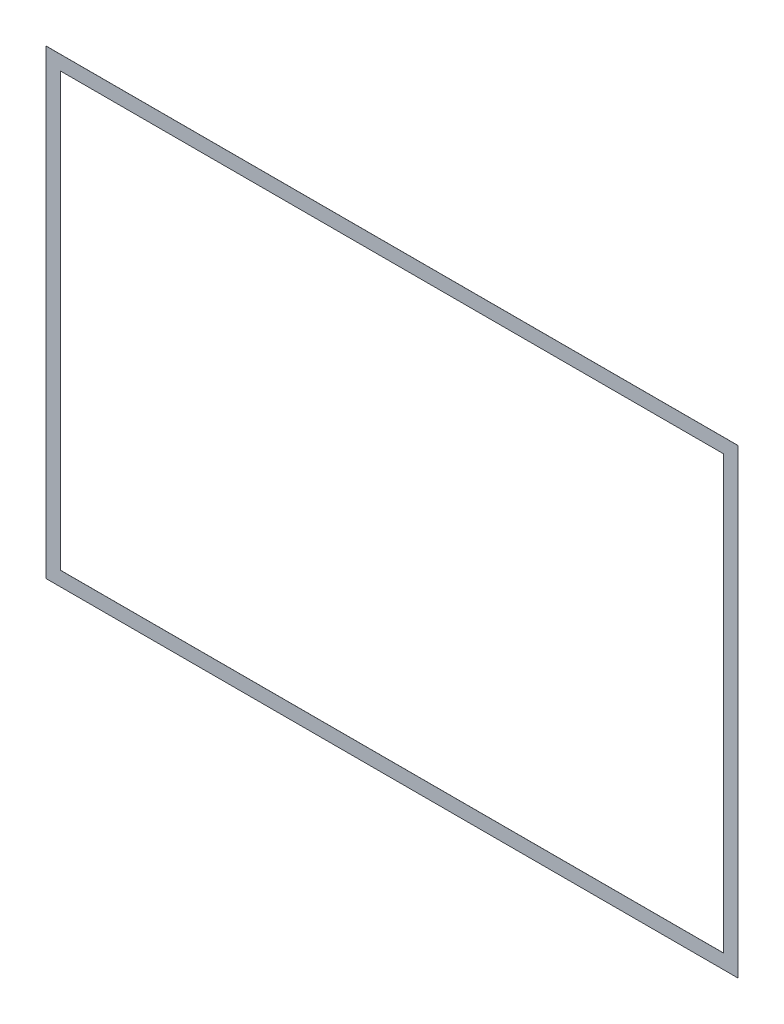
ISO-10303-21;
HEADER;
FILE_DESCRIPTION(('STEP AP214'),'2;1');
FILE_NAME('part.step','',(''),(''),'','','');
FILE_SCHEMA(('AUTOMOTIVE_DESIGN { 1 0 10303 214 1 1 1 1 }'));
ENDSEC;
DATA;
#1=APPLICATION_CONTEXT('core data for automotive mechanical design processes');
#2=APPLICATION_PROTOCOL_DEFINITION('international standard','automotive_design',2000,#1);
#3=PRODUCT_CONTEXT('',#1,'mechanical');
#4=PRODUCT('Part','Part','',(#3));
#5=PRODUCT_RELATED_PRODUCT_CATEGORY('part','',(#4));
#6=PRODUCT_DEFINITION_FORMATION('','',#4);
#7=PRODUCT_DEFINITION_CONTEXT('part definition',#1,'design');
#8=PRODUCT_DEFINITION('design','',#6,#7);
#9=PRODUCT_DEFINITION_SHAPE('','',#8);
#10=(LENGTH_UNIT() NAMED_UNIT(*) SI_UNIT(.MILLI.,.METRE.));
#11=(NAMED_UNIT(*) PLANE_ANGLE_UNIT() SI_UNIT($,.RADIAN.));
#12=(NAMED_UNIT(*) SI_UNIT($,.STERADIAN.) SOLID_ANGLE_UNIT());
#13=UNCERTAINTY_MEASURE_WITH_UNIT(LENGTH_MEASURE(1.E-05),#10,'distance_accuracy_value','');
#14=(GEOMETRIC_REPRESENTATION_CONTEXT(3) GLOBAL_UNCERTAINTY_ASSIGNED_CONTEXT((#13)) GLOBAL_UNIT_ASSIGNED_CONTEXT((#10,
#11,#12)) REPRESENTATION_CONTEXT('',''));
#15=CARTESIAN_POINT('',(0.,0.,0.));
#16=DIRECTION('',(0.,0.,1.));
#17=DIRECTION('',(1.,0.,0.));
#18=AXIS2_PLACEMENT_3D('',#15,#16,#17);
#19=CARTESIAN_POINT('',(0.,0.,0.026));
#20=DIRECTION('',(0.,0.,1.));
#21=DIRECTION('',(1.,0.,0.));
#22=AXIS2_PLACEMENT_3D('',#19,#20,#21);
#23=PLANE('',#22);
#24=DIRECTION('',(0.,1.,0.));
#25=VECTOR('',#24,1.);
#26=CARTESIAN_POINT('',(300.,200.,0.026));
#27=LINE('',#26,#25);
#28=CARTESIAN_POINT('',(300.,-200.,0.026));
#29=VERTEX_POINT('',#28);
#30=CARTESIAN_POINT('',(300.,200.,0.026));
#31=VERTEX_POINT('',#30);
#32=EDGE_CURVE('E163',#29,#31,#27,.T.);
#33=ORIENTED_EDGE('',*,*,#32,.T.);
#34=DIRECTION('',(-1.,0.,0.));
#35=VECTOR('',#34,1.);
#36=CARTESIAN_POINT('',(-300.,200.,0.026));
#37=LINE('',#36,#35);
#38=CARTESIAN_POINT('',(-300.,200.,0.026));
#39=VERTEX_POINT('',#38);
#40=EDGE_CURVE('E167',#31,#39,#37,.T.);
#41=ORIENTED_EDGE('',*,*,#40,.T.);
#42=DIRECTION('',(0.,-1.,0.));
#43=VECTOR('',#42,1.);
#44=CARTESIAN_POINT('',(-300.,200.,0.026));
#45=LINE('',#44,#43);
#46=CARTESIAN_POINT('',(-300.,-200.,0.026));
#47=VERTEX_POINT('',#46);
#48=EDGE_CURVE('E171',#39,#47,#45,.T.);
#49=ORIENTED_EDGE('',*,*,#48,.T.);
#50=DIRECTION('',(1.,0.,0.));
#51=VECTOR('',#50,1.);
#52=CARTESIAN_POINT('',(-300.,-200.,0.026));
#53=LINE('',#52,#51);
#54=EDGE_CURVE('E174',#47,#29,#53,.T.);
#55=ORIENTED_EDGE('',*,*,#54,.T.);
#56=EDGE_LOOP('',(#33,#41,#49,#55));
#57=FACE_BOUND('',#56,.T.);
#58=DIRECTION('',(-1.,0.,0.));
#59=VECTOR('',#58,1.);
#60=CARTESIAN_POINT('',(-287.5,187.5,0.026));
#61=LINE('',#60,#59);
#62=CARTESIAN_POINT('',(287.5,187.5,0.026));
#63=VERTEX_POINT('',#62);
#64=CARTESIAN_POINT('',(-287.5,187.5,0.026));
#65=VERTEX_POINT('',#64);
#66=EDGE_CURVE('E124',#63,#65,#61,.T.);
#67=ORIENTED_EDGE('',*,*,#66,.F.);
#68=DIRECTION('',(0.,1.,0.));
#69=VECTOR('',#68,1.);
#70=CARTESIAN_POINT('',(287.5,187.5,0.026));
#71=LINE('',#70,#69);
#72=CARTESIAN_POINT('',(287.5,-187.5,0.026));
#73=VERTEX_POINT('',#72);
#74=EDGE_CURVE('E115',#73,#63,#71,.T.);
#75=ORIENTED_EDGE('',*,*,#74,.F.);
#76=DIRECTION('',(1.,0.,0.));
#77=VECTOR('',#76,1.);
#78=CARTESIAN_POINT('',(-287.5,-187.5,0.026));
#79=LINE('',#78,#77);
#80=CARTESIAN_POINT('',(-287.5,-187.5,0.026));
#81=VERTEX_POINT('',#80);
#82=EDGE_CURVE('E141',#81,#73,#79,.T.);
#83=ORIENTED_EDGE('',*,*,#82,.F.);
#84=DIRECTION('',(0.,-1.,0.));
#85=VECTOR('',#84,1.);
#86=CARTESIAN_POINT('',(-287.5,187.5,0.026));
#87=LINE('',#86,#85);
#88=EDGE_CURVE('E137',#65,#81,#87,.T.);
#89=ORIENTED_EDGE('',*,*,#88,.F.);
#90=EDGE_LOOP('',(#67,#75,#83,#89));
#91=FACE_BOUND('',#90,.T.);
#92=ADVANCED_FACE('F49',(#57,#91),#23,.T.);
#93=CARTESIAN_POINT('',(0.,0.,-0.026));
#94=DIRECTION('',(0.,0.,1.));
#95=DIRECTION('',(1.,0.,0.));
#96=AXIS2_PLACEMENT_3D('',#93,#94,#95);
#97=PLANE('',#96);
#98=DIRECTION('',(0.,1.,0.));
#99=VECTOR('',#98,1.);
#100=CARTESIAN_POINT('',(300.,200.,-0.026));
#101=LINE('',#100,#99);
#102=CARTESIAN_POINT('',(300.,-200.,-0.026));
#103=VERTEX_POINT('',#102);
#104=CARTESIAN_POINT('',(300.,200.,-0.026));
#105=VERTEX_POINT('',#104);
#106=EDGE_CURVE('E133',#103,#105,#101,.T.);
#107=ORIENTED_EDGE('',*,*,#106,.F.);
#108=DIRECTION('',(1.,0.,0.));
#109=VECTOR('',#108,1.);
#110=CARTESIAN_POINT('',(-300.,-200.,-0.026));
#111=LINE('',#110,#109);
#112=CARTESIAN_POINT('',(-300.,-200.,-0.026));
#113=VERTEX_POINT('',#112);
#114=EDGE_CURVE('E168',#113,#103,#111,.T.);
#115=ORIENTED_EDGE('',*,*,#114,.F.);
#116=DIRECTION('',(0.,-1.,0.));
#117=VECTOR('',#116,1.);
#118=CARTESIAN_POINT('',(-300.,200.,-0.026));
#119=LINE('',#118,#117);
#120=CARTESIAN_POINT('',(-300.,200.,-0.026));
#121=VERTEX_POINT('',#120);
#122=EDGE_CURVE('E184',#121,#113,#119,.T.);
#123=ORIENTED_EDGE('',*,*,#122,.F.);
#124=DIRECTION('',(-1.,0.,0.));
#125=VECTOR('',#124,1.);
#126=CARTESIAN_POINT('',(-300.,200.,-0.026));
#127=LINE('',#126,#125);
#128=EDGE_CURVE('E181',#105,#121,#127,.T.);
#129=ORIENTED_EDGE('',*,*,#128,.F.);
#130=EDGE_LOOP('',(#107,#115,#123,#129));
#131=FACE_BOUND('',#130,.T.);
#132=DIRECTION('',(0.,1.,0.));
#133=VECTOR('',#132,1.);
#134=CARTESIAN_POINT('',(287.5,187.5,-0.026));
#135=LINE('',#134,#133);
#136=CARTESIAN_POINT('',(287.5,-187.5,-0.026));
#137=VERTEX_POINT('',#136);
#138=CARTESIAN_POINT('',(287.5,187.5,-0.026));
#139=VERTEX_POINT('',#138);
#140=EDGE_CURVE('E73',#137,#139,#135,.T.);
#141=ORIENTED_EDGE('',*,*,#140,.T.);
#142=DIRECTION('',(-1.,0.,0.));
#143=VECTOR('',#142,1.);
#144=CARTESIAN_POINT('',(-287.5,187.5,-0.026));
#145=LINE('',#144,#143);
#146=CARTESIAN_POINT('',(-287.5,187.5,-0.026));
#147=VERTEX_POINT('',#146);
#148=EDGE_CURVE('E131',#139,#147,#145,.T.);
#149=ORIENTED_EDGE('',*,*,#148,.T.);
#150=DIRECTION('',(0.,-1.,0.));
#151=VECTOR('',#150,1.);
#152=CARTESIAN_POINT('',(-287.5,187.5,-0.026));
#153=LINE('',#152,#151);
#154=CARTESIAN_POINT('',(-287.5,-187.5,-0.026));
#155=VERTEX_POINT('',#154);
#156=EDGE_CURVE('E150',#147,#155,#153,.T.);
#157=ORIENTED_EDGE('',*,*,#156,.T.);
#158=DIRECTION('',(1.,0.,0.));
#159=VECTOR('',#158,1.);
#160=CARTESIAN_POINT('',(-287.5,-187.5,-0.026));
#161=LINE('',#160,#159);
#162=EDGE_CURVE('E125',#155,#137,#161,.T.);
#163=ORIENTED_EDGE('',*,*,#162,.T.);
#164=EDGE_LOOP('',(#141,#149,#157,#163));
#165=FACE_BOUND('',#164,.T.);
#166=ADVANCED_FACE('F207',(#131,#165),#97,.F.);
#167=CARTESIAN_POINT('',(300.,200.,0.026));
#168=DIRECTION('',(-1.,0.,0.));
#169=DIRECTION('',(0.,0.,1.));
#170=AXIS2_PLACEMENT_3D('',#167,#168,#169);
#171=PLANE('',#170);
#172=ORIENTED_EDGE('',*,*,#106,.T.);
#173=DIRECTION('',(0.,0.,-1.));
#174=VECTOR('',#173,1.);
#175=CARTESIAN_POINT('',(300.,200.,0.026));
#176=LINE('',#175,#174);
#177=EDGE_CURVE('E11',#31,#105,#176,.T.);
#178=ORIENTED_EDGE('',*,*,#177,.F.);
#179=ORIENTED_EDGE('',*,*,#32,.F.);
#180=DIRECTION('',(0.,0.,-1.));
#181=VECTOR('',#180,1.);
#182=CARTESIAN_POINT('',(300.,-200.,0.026));
#183=LINE('',#182,#181);
#184=EDGE_CURVE('E177',#29,#103,#183,.T.);
#185=ORIENTED_EDGE('',*,*,#184,.T.);
#186=EDGE_LOOP('',(#172,#178,#179,#185));
#187=FACE_BOUND('',#186,.T.);
#188=ADVANCED_FACE('F51',(#187),#171,.F.);
#189=CARTESIAN_POINT('',(-300.,200.,0.026));
#190=DIRECTION('',(0.,-1.,0.));
#191=DIRECTION('',(0.,0.,-1.));
#192=AXIS2_PLACEMENT_3D('',#189,#190,#191);
#193=PLANE('',#192);
#194=ORIENTED_EDGE('',*,*,#128,.T.);
#195=DIRECTION('',(0.,0.,-1.));
#196=VECTOR('',#195,1.);
#197=CARTESIAN_POINT('',(-300.,200.,0.026));
#198=LINE('',#197,#196);
#199=EDGE_CURVE('E58',#39,#121,#198,.T.);
#200=ORIENTED_EDGE('',*,*,#199,.F.);
#201=ORIENTED_EDGE('',*,*,#40,.F.);
#202=ORIENTED_EDGE('',*,*,#177,.T.);
#203=EDGE_LOOP('',(#194,#200,#201,#202));
#204=FACE_BOUND('',#203,.T.);
#205=ADVANCED_FACE('F217',(#204),#193,.F.);
#206=CARTESIAN_POINT('',(-300.,200.,0.026));
#207=DIRECTION('',(1.,0.,0.));
#208=DIRECTION('',(0.,0.,-1.));
#209=AXIS2_PLACEMENT_3D('',#206,#207,#208);
#210=PLANE('',#209);
#211=ORIENTED_EDGE('',*,*,#122,.T.);
#212=DIRECTION('',(0.,0.,-1.));
#213=VECTOR('',#212,1.);
#214=CARTESIAN_POINT('',(-300.,-200.,0.026));
#215=LINE('',#214,#213);
#216=EDGE_CURVE('E192',#47,#113,#215,.T.);
#217=ORIENTED_EDGE('',*,*,#216,.F.);
#218=ORIENTED_EDGE('',*,*,#48,.F.);
#219=ORIENTED_EDGE('',*,*,#199,.T.);
#220=EDGE_LOOP('',(#211,#217,#218,#219));
#221=FACE_BOUND('',#220,.T.);
#222=ADVANCED_FACE('F201',(#221),#210,.F.);
#223=CARTESIAN_POINT('',(-300.,-200.,0.026));
#224=DIRECTION('',(0.,1.,0.));
#225=DIRECTION('',(0.,0.,1.));
#226=AXIS2_PLACEMENT_3D('',#223,#224,#225);
#227=PLANE('',#226);
#228=ORIENTED_EDGE('',*,*,#114,.T.);
#229=ORIENTED_EDGE('',*,*,#184,.F.);
#230=ORIENTED_EDGE('',*,*,#54,.F.);
#231=ORIENTED_EDGE('',*,*,#216,.T.);
#232=EDGE_LOOP('',(#228,#229,#230,#231));
#233=FACE_BOUND('',#232,.T.);
#234=ADVANCED_FACE('F211',(#233),#227,.F.);
#235=CARTESIAN_POINT('',(287.5,187.5,0.026));
#236=DIRECTION('',(-1.,0.,0.));
#237=DIRECTION('',(0.,0.,1.));
#238=AXIS2_PLACEMENT_3D('',#235,#236,#237);
#239=PLANE('',#238);
#240=ORIENTED_EDGE('',*,*,#140,.F.);
#241=DIRECTION('',(0.,0.,-1.));
#242=VECTOR('',#241,1.);
#243=CARTESIAN_POINT('',(287.5,-187.5,0.026));
#244=LINE('',#243,#242);
#245=EDGE_CURVE('E119',#73,#137,#244,.T.);
#246=ORIENTED_EDGE('',*,*,#245,.F.);
#247=ORIENTED_EDGE('',*,*,#74,.T.);
#248=DIRECTION('',(0.,0.,-1.));
#249=VECTOR('',#248,1.);
#250=CARTESIAN_POINT('',(287.5,187.5,0.026));
#251=LINE('',#250,#249);
#252=EDGE_CURVE('E118',#63,#139,#251,.T.);
#253=ORIENTED_EDGE('',*,*,#252,.T.);
#254=EDGE_LOOP('',(#240,#246,#247,#253));
#255=FACE_BOUND('',#254,.T.);
#256=ADVANCED_FACE('F117',(#255),#239,.T.);
#257=CARTESIAN_POINT('',(-287.5,187.5,0.026));
#258=DIRECTION('',(0.,-1.,0.));
#259=DIRECTION('',(0.,0.,-1.));
#260=AXIS2_PLACEMENT_3D('',#257,#258,#259);
#261=PLANE('',#260);
#262=ORIENTED_EDGE('',*,*,#148,.F.);
#263=ORIENTED_EDGE('',*,*,#252,.F.);
#264=ORIENTED_EDGE('',*,*,#66,.T.);
#265=DIRECTION('',(0.,0.,-1.));
#266=VECTOR('',#265,1.);
#267=CARTESIAN_POINT('',(-287.5,187.5,0.026));
#268=LINE('',#267,#266);
#269=EDGE_CURVE('E134',#65,#147,#268,.T.);
#270=ORIENTED_EDGE('',*,*,#269,.T.);
#271=EDGE_LOOP('',(#262,#263,#264,#270));
#272=FACE_BOUND('',#271,.T.);
#273=ADVANCED_FACE('F128',(#272),#261,.T.);
#274=CARTESIAN_POINT('',(-287.5,187.5,0.026));
#275=DIRECTION('',(1.,0.,0.));
#276=DIRECTION('',(0.,0.,-1.));
#277=AXIS2_PLACEMENT_3D('',#274,#275,#276);
#278=PLANE('',#277);
#279=ORIENTED_EDGE('',*,*,#156,.F.);
#280=ORIENTED_EDGE('',*,*,#269,.F.);
#281=ORIENTED_EDGE('',*,*,#88,.T.);
#282=DIRECTION('',(0.,0.,-1.));
#283=VECTOR('',#282,1.);
#284=CARTESIAN_POINT('',(-287.5,-187.5,0.026));
#285=LINE('',#284,#283);
#286=EDGE_CURVE('E65',#81,#155,#285,.T.);
#287=ORIENTED_EDGE('',*,*,#286,.T.);
#288=EDGE_LOOP('',(#279,#280,#281,#287));
#289=FACE_BOUND('',#288,.T.);
#290=ADVANCED_FACE('F240',(#289),#278,.T.);
#291=CARTESIAN_POINT('',(-287.5,-187.5,0.026));
#292=DIRECTION('',(0.,1.,0.));
#293=DIRECTION('',(0.,0.,1.));
#294=AXIS2_PLACEMENT_3D('',#291,#292,#293);
#295=PLANE('',#294);
#296=ORIENTED_EDGE('',*,*,#162,.F.);
#297=ORIENTED_EDGE('',*,*,#286,.F.);
#298=ORIENTED_EDGE('',*,*,#82,.T.);
#299=ORIENTED_EDGE('',*,*,#245,.T.);
#300=EDGE_LOOP('',(#296,#297,#298,#299));
#301=FACE_BOUND('',#300,.T.);
#302=ADVANCED_FACE('F244',(#301),#295,.T.);
#303=CLOSED_SHELL('',(#92,#166,#188,#205,#222,#234,#256,#273,#290,#302));
#304=MANIFOLD_SOLID_BREP('B2',#303);
#305=ADVANCED_BREP_SHAPE_REPRESENTATION('',(#18,#304),#14);
#306=SHAPE_DEFINITION_REPRESENTATION(#9,#305);
ENDSEC;
END-ISO-10303-21;
